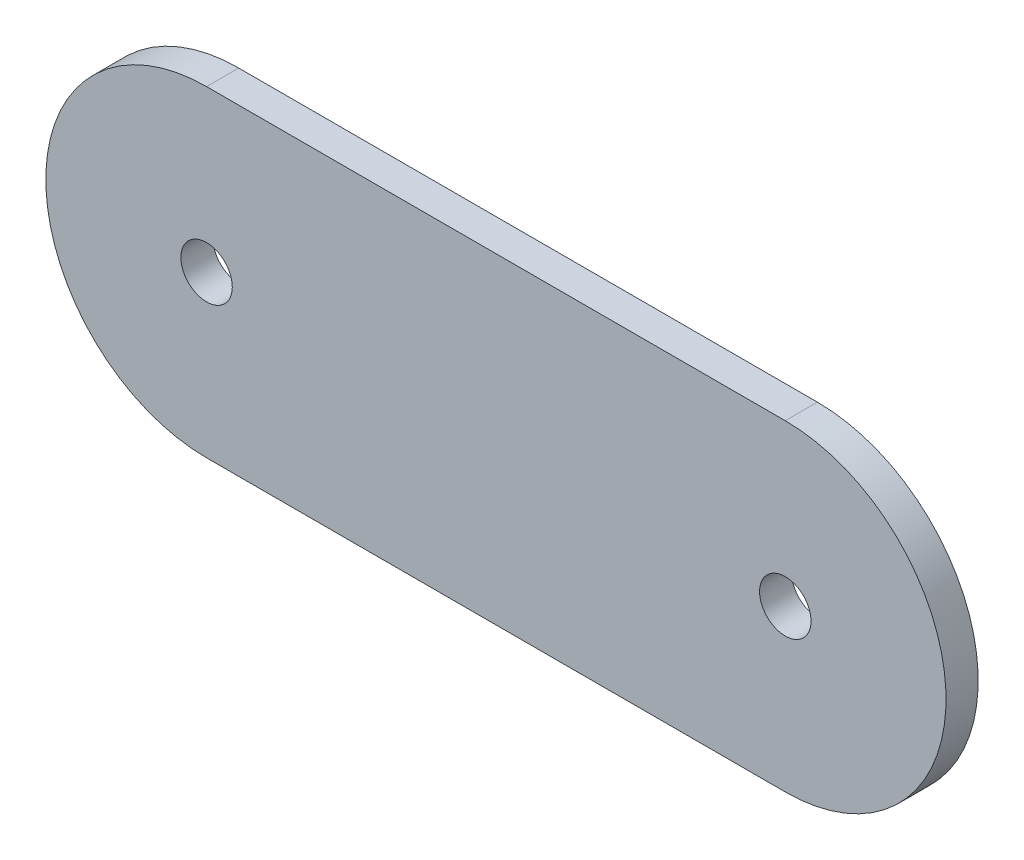
ISO-10303-21;
HEADER;
FILE_DESCRIPTION(('STEP AP214'),'2;1');
FILE_NAME('part.step','',(''),(''),'','','');
FILE_SCHEMA(('AUTOMOTIVE_DESIGN { 1 0 10303 214 1 1 1 1 }'));
ENDSEC;
DATA;
#1=APPLICATION_CONTEXT('core data for automotive mechanical design processes');
#2=APPLICATION_PROTOCOL_DEFINITION('international standard','automotive_design',2000,#1);
#3=PRODUCT_CONTEXT('',#1,'mechanical');
#4=PRODUCT('Part','Part','',(#3));
#5=PRODUCT_RELATED_PRODUCT_CATEGORY('part','',(#4));
#6=PRODUCT_DEFINITION_FORMATION('','',#4);
#7=PRODUCT_DEFINITION_CONTEXT('part definition',#1,'design');
#8=PRODUCT_DEFINITION('design','',#6,#7);
#9=PRODUCT_DEFINITION_SHAPE('','',#8);
#10=(LENGTH_UNIT() NAMED_UNIT(*) SI_UNIT(.MILLI.,.METRE.));
#11=(NAMED_UNIT(*) PLANE_ANGLE_UNIT() SI_UNIT($,.RADIAN.));
#12=(NAMED_UNIT(*) SI_UNIT($,.STERADIAN.) SOLID_ANGLE_UNIT());
#13=UNCERTAINTY_MEASURE_WITH_UNIT(LENGTH_MEASURE(1.E-05),#10,'distance_accuracy_value','');
#14=(GEOMETRIC_REPRESENTATION_CONTEXT(3) GLOBAL_UNCERTAINTY_ASSIGNED_CONTEXT((#13)) GLOBAL_UNIT_ASSIGNED_CONTEXT((#10,
#11,#12)) REPRESENTATION_CONTEXT('',''));
#15=CARTESIAN_POINT('',(0.,0.,0.));
#16=DIRECTION('',(0.,0.,1.));
#17=DIRECTION('',(1.,0.,0.));
#18=AXIS2_PLACEMENT_3D('',#15,#16,#17);
#19=CARTESIAN_POINT('',(-29.1999365646896,0.,2.5));
#20=DIRECTION('',(0.,0.,1.));
#21=DIRECTION('',(1.,0.,0.));
#22=AXIS2_PLACEMENT_3D('',#19,#20,#21);
#23=PLANE('',#22);
#24=CARTESIAN_POINT('',(-29.1999365646896,0.,2.5));
#25=DIRECTION('',(0.,0.,1.));
#26=DIRECTION('',(1.,0.,0.));
#27=AXIS2_PLACEMENT_3D('',#24,#25,#26);
#28=CIRCLE('',#27,2.);
#29=CARTESIAN_POINT('',(-27.1999365646896,0.,2.5));
#30=VERTEX_POINT('',#29);
#31=EDGE_CURVE('E115',#30,#30,#28,.T.);
#32=ORIENTED_EDGE('',*,*,#31,.F.);
#33=EDGE_LOOP('',(#32));
#34=FACE_BOUND('',#33,.T.);
#35=CARTESIAN_POINT('',(-29.1999365646896,0.,2.5));
#36=DIRECTION('',(0.,0.,1.));
#37=DIRECTION('',(1.,0.,0.));
#38=AXIS2_PLACEMENT_3D('',#35,#36,#37);
#39=CIRCLE('',#38,12.5);
#40=CARTESIAN_POINT('',(-29.1999365646896,12.5,2.5));
#41=VERTEX_POINT('',#40);
#42=CARTESIAN_POINT('',(-29.1999365646896,-12.5,2.5));
#43=VERTEX_POINT('',#42);
#44=EDGE_CURVE('E95',#41,#43,#39,.T.);
#45=ORIENTED_EDGE('',*,*,#44,.T.);
#46=DIRECTION('',(1.,0.,0.));
#47=VECTOR('',#46,1.);
#48=CARTESIAN_POINT('',(-29.1999365646896,-12.5,2.5));
#49=LINE('',#48,#47);
#50=CARTESIAN_POINT('',(15.8000634353104,-12.5,2.5));
#51=VERTEX_POINT('',#50);
#52=EDGE_CURVE('E90',#43,#51,#49,.T.);
#53=ORIENTED_EDGE('',*,*,#52,.T.);
#54=CARTESIAN_POINT('',(15.8000634353104,0.,2.5));
#55=DIRECTION('',(0.,0.,1.));
#56=DIRECTION('',(1.,0.,0.));
#57=AXIS2_PLACEMENT_3D('',#54,#55,#56);
#58=CIRCLE('',#57,12.5);
#59=CARTESIAN_POINT('',(15.8000634353104,12.5,2.5));
#60=VERTEX_POINT('',#59);
#61=EDGE_CURVE('E93',#51,#60,#58,.T.);
#62=ORIENTED_EDGE('',*,*,#61,.T.);
#63=DIRECTION('',(-1.,0.,0.));
#64=VECTOR('',#63,1.);
#65=CARTESIAN_POINT('',(-29.1999365646896,12.5,2.5));
#66=LINE('',#65,#64);
#67=EDGE_CURVE('E60',#60,#41,#66,.T.);
#68=ORIENTED_EDGE('',*,*,#67,.T.);
#69=EDGE_LOOP('',(#45,#53,#62,#68));
#70=FACE_BOUND('',#69,.T.);
#71=CARTESIAN_POINT('',(15.8000634353104,0.,2.5));
#72=DIRECTION('',(0.,0.,1.));
#73=DIRECTION('',(1.,0.,0.));
#74=AXIS2_PLACEMENT_3D('',#71,#72,#73);
#75=CIRCLE('',#74,2.);
#76=CARTESIAN_POINT('',(17.8000634353104,0.,2.5));
#77=VERTEX_POINT('',#76);
#78=EDGE_CURVE('E137',#77,#77,#75,.T.);
#79=ORIENTED_EDGE('',*,*,#78,.F.);
#80=EDGE_LOOP('',(#79));
#81=FACE_BOUND('',#80,.T.);
#82=ADVANCED_FACE('F42',(#34,#70,#81),#23,.T.);
#83=CARTESIAN_POINT('',(-29.1999365646896,0.,0.));
#84=DIRECTION('',(0.,0.,1.));
#85=DIRECTION('',(1.,0.,0.));
#86=AXIS2_PLACEMENT_3D('',#83,#84,#85);
#87=PLANE('',#86);
#88=CARTESIAN_POINT('',(-29.1999365646896,0.,0.));
#89=DIRECTION('',(0.,0.,1.));
#90=DIRECTION('',(1.,0.,0.));
#91=AXIS2_PLACEMENT_3D('',#88,#89,#90);
#92=CIRCLE('',#91,12.5);
#93=CARTESIAN_POINT('',(-29.1999365646896,12.5,0.));
#94=VERTEX_POINT('',#93);
#95=CARTESIAN_POINT('',(-29.1999365646896,-12.5,0.));
#96=VERTEX_POINT('',#95);
#97=EDGE_CURVE('E111',#94,#96,#92,.T.);
#98=ORIENTED_EDGE('',*,*,#97,.F.);
#99=DIRECTION('',(-1.,0.,0.));
#100=VECTOR('',#99,1.);
#101=CARTESIAN_POINT('',(-29.1999365646896,12.5,0.));
#102=LINE('',#101,#100);
#103=CARTESIAN_POINT('',(15.8000634353104,12.5,0.));
#104=VERTEX_POINT('',#103);
#105=EDGE_CURVE('E83',#104,#94,#102,.T.);
#106=ORIENTED_EDGE('',*,*,#105,.F.);
#107=CARTESIAN_POINT('',(15.8000634353104,0.,0.));
#108=DIRECTION('',(0.,0.,1.));
#109=DIRECTION('',(1.,0.,0.));
#110=AXIS2_PLACEMENT_3D('',#107,#108,#109);
#111=CIRCLE('',#110,12.5);
#112=CARTESIAN_POINT('',(15.8000634353104,-12.5,0.));
#113=VERTEX_POINT('',#112);
#114=EDGE_CURVE('E77',#113,#104,#111,.T.);
#115=ORIENTED_EDGE('',*,*,#114,.F.);
#116=DIRECTION('',(1.,0.,0.));
#117=VECTOR('',#116,1.);
#118=CARTESIAN_POINT('',(-29.1999365646896,-12.5,0.));
#119=LINE('',#118,#117);
#120=EDGE_CURVE('E100',#96,#113,#119,.T.);
#121=ORIENTED_EDGE('',*,*,#120,.F.);
#122=EDGE_LOOP('',(#98,#106,#115,#121));
#123=FACE_BOUND('',#122,.T.);
#124=CARTESIAN_POINT('',(-29.1999365646896,0.,0.));
#125=DIRECTION('',(0.,0.,1.));
#126=DIRECTION('',(1.,0.,0.));
#127=AXIS2_PLACEMENT_3D('',#124,#125,#126);
#128=CIRCLE('',#127,2.);
#129=CARTESIAN_POINT('',(-27.1999365646896,0.,0.));
#130=VERTEX_POINT('',#129);
#131=EDGE_CURVE('E133',#130,#130,#128,.T.);
#132=ORIENTED_EDGE('',*,*,#131,.T.);
#133=EDGE_LOOP('',(#132));
#134=FACE_BOUND('',#133,.T.);
#135=CARTESIAN_POINT('',(15.8000634353104,0.,0.));
#136=DIRECTION('',(0.,0.,1.));
#137=DIRECTION('',(1.,0.,0.));
#138=AXIS2_PLACEMENT_3D('',#135,#136,#137);
#139=CIRCLE('',#138,2.);
#140=CARTESIAN_POINT('',(17.8000634353104,0.,0.));
#141=VERTEX_POINT('',#140);
#142=EDGE_CURVE('E141',#141,#141,#139,.T.);
#143=ORIENTED_EDGE('',*,*,#142,.T.);
#144=EDGE_LOOP('',(#143));
#145=FACE_BOUND('',#144,.T.);
#146=ADVANCED_FACE('F128',(#123,#134,#145),#87,.F.);
#147=CARTESIAN_POINT('',(-29.1999365646896,0.,2.5));
#148=DIRECTION('',(0.,0.,-1.));
#149=DIRECTION('',(-1.,0.,0.));
#150=AXIS2_PLACEMENT_3D('',#147,#148,#149);
#151=CYLINDRICAL_SURFACE('',#150,12.5);
#152=ORIENTED_EDGE('',*,*,#97,.T.);
#153=DIRECTION('',(0.,0.,-1.));
#154=VECTOR('',#153,1.);
#155=CARTESIAN_POINT('',(-29.1999365646896,-12.5,2.5));
#156=LINE('',#155,#154);
#157=EDGE_CURVE('E11',#43,#96,#156,.T.);
#158=ORIENTED_EDGE('',*,*,#157,.F.);
#159=ORIENTED_EDGE('',*,*,#44,.F.);
#160=DIRECTION('',(0.,0.,-1.));
#161=VECTOR('',#160,1.);
#162=CARTESIAN_POINT('',(-29.1999365646896,12.5,2.5));
#163=LINE('',#162,#161);
#164=EDGE_CURVE('E107',#41,#94,#163,.T.);
#165=ORIENTED_EDGE('',*,*,#164,.T.);
#166=EDGE_LOOP('',(#152,#158,#159,#165));
#167=FACE_BOUND('',#166,.T.);
#168=ADVANCED_FACE('F44',(#167),#151,.T.);
#169=CARTESIAN_POINT('',(-29.1999365646896,-12.5,2.5));
#170=DIRECTION('',(0.,1.,0.));
#171=DIRECTION('',(0.,0.,1.));
#172=AXIS2_PLACEMENT_3D('',#169,#170,#171);
#173=PLANE('',#172);
#174=ORIENTED_EDGE('',*,*,#120,.T.);
#175=DIRECTION('',(0.,0.,-1.));
#176=VECTOR('',#175,1.);
#177=CARTESIAN_POINT('',(15.8000634353104,-12.5,2.5));
#178=LINE('',#177,#176);
#179=EDGE_CURVE('E52',#51,#113,#178,.T.);
#180=ORIENTED_EDGE('',*,*,#179,.F.);
#181=ORIENTED_EDGE('',*,*,#52,.F.);
#182=ORIENTED_EDGE('',*,*,#157,.T.);
#183=EDGE_LOOP('',(#174,#180,#181,#182));
#184=FACE_BOUND('',#183,.T.);
#185=ADVANCED_FACE('F99',(#184),#173,.F.);
#186=CARTESIAN_POINT('',(15.8000634353104,0.,2.5));
#187=DIRECTION('',(0.,0.,-1.));
#188=DIRECTION('',(-1.,0.,0.));
#189=AXIS2_PLACEMENT_3D('',#186,#187,#188);
#190=CYLINDRICAL_SURFACE('',#189,12.5);
#191=ORIENTED_EDGE('',*,*,#114,.T.);
#192=DIRECTION('',(0.,0.,-1.));
#193=VECTOR('',#192,1.);
#194=CARTESIAN_POINT('',(15.8000634353104,12.5,2.5));
#195=LINE('',#194,#193);
#196=EDGE_CURVE('E102',#60,#104,#195,.T.);
#197=ORIENTED_EDGE('',*,*,#196,.F.);
#198=ORIENTED_EDGE('',*,*,#61,.F.);
#199=ORIENTED_EDGE('',*,*,#179,.T.);
#200=EDGE_LOOP('',(#191,#197,#198,#199));
#201=FACE_BOUND('',#200,.T.);
#202=ADVANCED_FACE('F103',(#201),#190,.T.);
#203=CARTESIAN_POINT('',(-29.1999365646896,12.5,2.5));
#204=DIRECTION('',(0.,-1.,0.));
#205=DIRECTION('',(0.,0.,-1.));
#206=AXIS2_PLACEMENT_3D('',#203,#204,#205);
#207=PLANE('',#206);
#208=ORIENTED_EDGE('',*,*,#105,.T.);
#209=ORIENTED_EDGE('',*,*,#164,.F.);
#210=ORIENTED_EDGE('',*,*,#67,.F.);
#211=ORIENTED_EDGE('',*,*,#196,.T.);
#212=EDGE_LOOP('',(#208,#209,#210,#211));
#213=FACE_BOUND('',#212,.T.);
#214=ADVANCED_FACE('F125',(#213),#207,.F.);
#215=CARTESIAN_POINT('',(-29.1999365646896,0.,2.5));
#216=DIRECTION('',(0.,0.,-1.));
#217=DIRECTION('',(-1.,0.,0.));
#218=AXIS2_PLACEMENT_3D('',#215,#216,#217);
#219=CYLINDRICAL_SURFACE('',#218,2.);
#220=ORIENTED_EDGE('',*,*,#31,.T.);
#221=EDGE_LOOP('',(#220));
#222=FACE_BOUND('',#221,.T.);
#223=ORIENTED_EDGE('',*,*,#131,.F.);
#224=EDGE_LOOP('',(#223));
#225=FACE_BOUND('',#224,.T.);
#226=ADVANCED_FACE('F160',(#222,#225),#219,.F.);
#227=CARTESIAN_POINT('',(15.8000634353104,0.,2.5));
#228=DIRECTION('',(0.,0.,-1.));
#229=DIRECTION('',(-1.,0.,0.));
#230=AXIS2_PLACEMENT_3D('',#227,#228,#229);
#231=CYLINDRICAL_SURFACE('',#230,2.);
#232=ORIENTED_EDGE('',*,*,#78,.T.);
#233=EDGE_LOOP('',(#232));
#234=FACE_BOUND('',#233,.T.);
#235=ORIENTED_EDGE('',*,*,#142,.F.);
#236=EDGE_LOOP('',(#235));
#237=FACE_BOUND('',#236,.T.);
#238=ADVANCED_FACE('F149',(#234,#237),#231,.F.);
#239=CLOSED_SHELL('',(#82,#146,#168,#185,#202,#214,#226,#238));
#240=MANIFOLD_SOLID_BREP('B2',#239);
#241=ADVANCED_BREP_SHAPE_REPRESENTATION('',(#18,#240),#14);
#242=SHAPE_DEFINITION_REPRESENTATION(#9,#241);
ENDSEC;
END-ISO-10303-21;
